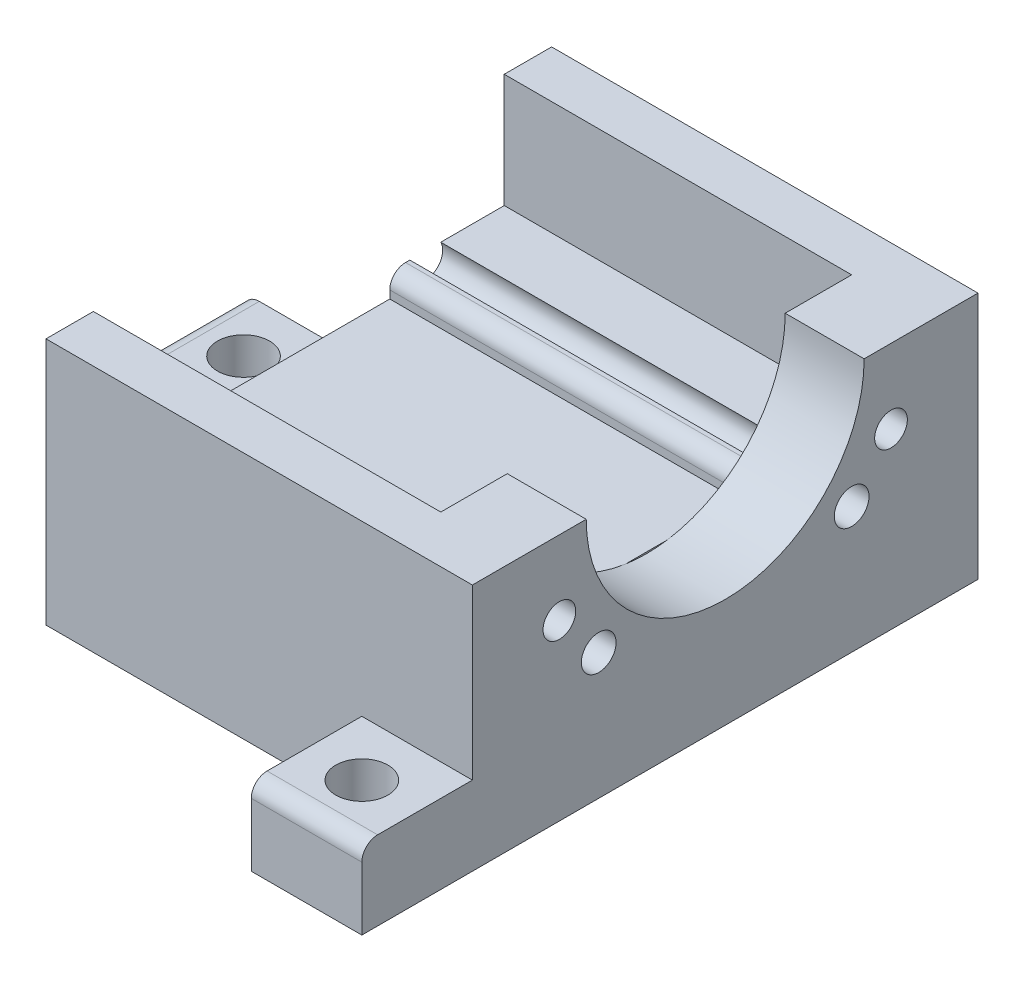
ISO-10303-21;
HEADER;
FILE_DESCRIPTION(('STEP AP214'),'2;1');
FILE_NAME('part.step','',(''),(''),'','','');
FILE_SCHEMA(('AUTOMOTIVE_DESIGN { 1 0 10303 214 1 1 1 1 }'));
ENDSEC;
DATA;
#1=APPLICATION_CONTEXT('core data for automotive mechanical design processes');
#2=APPLICATION_PROTOCOL_DEFINITION('international standard','automotive_design',2000,#1);
#3=PRODUCT_CONTEXT('',#1,'mechanical');
#4=PRODUCT('Part','Part','',(#3));
#5=PRODUCT_RELATED_PRODUCT_CATEGORY('part','',(#4));
#6=PRODUCT_DEFINITION_FORMATION('','',#4);
#7=PRODUCT_DEFINITION_CONTEXT('part definition',#1,'design');
#8=PRODUCT_DEFINITION('design','',#6,#7);
#9=PRODUCT_DEFINITION_SHAPE('','',#8);
#10=(LENGTH_UNIT() NAMED_UNIT(*) SI_UNIT(.MILLI.,.METRE.));
#11=(NAMED_UNIT(*) PLANE_ANGLE_UNIT() SI_UNIT($,.RADIAN.));
#12=(NAMED_UNIT(*) SI_UNIT($,.STERADIAN.) SOLID_ANGLE_UNIT());
#13=UNCERTAINTY_MEASURE_WITH_UNIT(LENGTH_MEASURE(1.E-05),#10,'distance_accuracy_value','');
#14=(GEOMETRIC_REPRESENTATION_CONTEXT(3) GLOBAL_UNCERTAINTY_ASSIGNED_CONTEXT((#13)) GLOBAL_UNIT_ASSIGNED_CONTEXT((#10,
#11,#12)) REPRESENTATION_CONTEXT('',''));
#15=CARTESIAN_POINT('',(0.,0.,0.));
#16=DIRECTION('',(0.,0.,1.));
#17=DIRECTION('',(1.,0.,0.));
#18=AXIS2_PLACEMENT_3D('',#15,#16,#17);
#19=CARTESIAN_POINT('',(-11.,0.,0.));
#20=DIRECTION('',(1.,0.,0.));
#21=DIRECTION('',(0.,0.,-1.));
#22=AXIS2_PLACEMENT_3D('',#19,#20,#21);
#23=PLANE('',#22);
#24=DIRECTION('',(0.,0.,1.));
#25=VECTOR('',#24,1.);
#26=CARTESIAN_POINT('',(-11.,8.5,5.7589));
#27=LINE('',#26,#25);
#28=CARTESIAN_POINT('',(-11.,8.5,6.7589));
#29=VERTEX_POINT('',#28);
#30=CARTESIAN_POINT('',(-11.,8.5,7.02910410288673));
#31=VERTEX_POINT('',#30);
#32=EDGE_CURVE('E428',#29,#31,#27,.T.);
#33=ORIENTED_EDGE('',*,*,#32,.F.);
#34=CARTESIAN_POINT('',(-11.,7.5,6.7589));
#35=DIRECTION('',(1.,0.,0.));
#36=DIRECTION('',(0.,0.,-1.));
#37=AXIS2_PLACEMENT_3D('',#34,#35,#36);
#38=CIRCLE('',#37,1.);
#39=CARTESIAN_POINT('',(-11.,7.5,5.7589));
#40=VERTEX_POINT('',#39);
#41=EDGE_CURVE('E451',#29,#40,#38,.F.);
#42=ORIENTED_EDGE('',*,*,#41,.T.);
#43=DIRECTION('',(0.,1.,0.));
#44=VECTOR('',#43,1.);
#45=CARTESIAN_POINT('',(-11.,7.,5.7589));
#46=LINE('',#45,#44);
#47=CARTESIAN_POINT('',(-11.,7.,5.7589));
#48=VERTEX_POINT('',#47);
#49=EDGE_CURVE('E424',#48,#40,#46,.T.);
#50=ORIENTED_EDGE('',*,*,#49,.F.);
#51=DIRECTION('',(0.,0.,1.));
#52=VECTOR('',#51,1.);
#53=CARTESIAN_POINT('',(-11.,7.,-5.7589));
#54=LINE('',#53,#52);
#55=CARTESIAN_POINT('',(-11.,7.,-5.7589));
#56=VERTEX_POINT('',#55);
#57=EDGE_CURVE('E422',#56,#48,#54,.T.);
#58=ORIENTED_EDGE('',*,*,#57,.F.);
#59=DIRECTION('',(0.,-1.,0.));
#60=VECTOR('',#59,1.);
#61=CARTESIAN_POINT('',(-11.,8.5,-5.7589));
#62=LINE('',#61,#60);
#63=CARTESIAN_POINT('',(-11.,7.5,-5.7589));
#64=VERTEX_POINT('',#63);
#65=EDGE_CURVE('E420',#64,#56,#62,.T.);
#66=ORIENTED_EDGE('',*,*,#65,.F.);
#67=CARTESIAN_POINT('',(-11.,7.5,-6.7589));
#68=DIRECTION('',(1.,0.,0.));
#69=DIRECTION('',(0.,0.,-1.));
#70=AXIS2_PLACEMENT_3D('',#67,#68,#69);
#71=CIRCLE('',#70,1.);
#72=CARTESIAN_POINT('',(-11.,8.5,-6.7589));
#73=VERTEX_POINT('',#72);
#74=EDGE_CURVE('E449',#64,#73,#71,.F.);
#75=ORIENTED_EDGE('',*,*,#74,.T.);
#76=DIRECTION('',(0.,0.,1.));
#77=VECTOR('',#76,1.);
#78=CARTESIAN_POINT('',(-11.,8.5,-13.0089));
#79=LINE('',#78,#77);
#80=CARTESIAN_POINT('',(-11.,8.5,-7.02910410288673));
#81=VERTEX_POINT('',#80);
#82=EDGE_CURVE('E416',#81,#73,#79,.T.);
#83=ORIENTED_EDGE('',*,*,#82,.F.);
#84=CARTESIAN_POINT('',(-11.,8.,-8.0089));
#85=DIRECTION('',(1.,0.,0.));
#86=DIRECTION('',(0.,0.,1.));
#87=AXIS2_PLACEMENT_3D('',#84,#85,#86);
#88=CIRCLE('',#87,1.1);
#89=CARTESIAN_POINT('',(-11.,8.5,-8.98869589711327));
#90=VERTEX_POINT('',#89);
#91=EDGE_CURVE('E296',#81,#90,#88,.T.);
#92=ORIENTED_EDGE('',*,*,#91,.T.);
#93=CARTESIAN_POINT('',(-11.,8.5,-13.0089));
#94=VERTEX_POINT('',#93);
#95=EDGE_CURVE('E417',#94,#90,#79,.T.);
#96=ORIENTED_EDGE('',*,*,#95,.F.);
#97=DIRECTION('',(0.,-1.,0.));
#98=VECTOR('',#97,1.);
#99=CARTESIAN_POINT('',(-11.,15.7,-13.0089));
#100=LINE('',#99,#98);
#101=CARTESIAN_POINT('',(-11.,15.7,-13.0089));
#102=VERTEX_POINT('',#101);
#103=EDGE_CURVE('E387',#102,#94,#100,.T.);
#104=ORIENTED_EDGE('',*,*,#103,.F.);
#105=DIRECTION('',(0.,0.,-1.));
#106=VECTOR('',#105,1.);
#107=CARTESIAN_POINT('',(-11.,15.7,-13.0089));
#108=LINE('',#107,#106);
#109=CARTESIAN_POINT('',(-11.,15.7,-16.0089));
#110=VERTEX_POINT('',#109);
#111=EDGE_CURVE('E377',#102,#110,#108,.T.);
#112=ORIENTED_EDGE('',*,*,#111,.T.);
#113=DIRECTION('',(0.,-1.,0.));
#114=VECTOR('',#113,1.);
#115=CARTESIAN_POINT('',(-11.,15.7,-16.0089));
#116=LINE('',#115,#114);
#117=CARTESIAN_POINT('',(-11.,0.,-16.0089));
#118=VERTEX_POINT('',#117);
#119=EDGE_CURVE('E385',#110,#118,#116,.T.);
#120=ORIENTED_EDGE('',*,*,#119,.T.);
#121=DIRECTION('',(0.,0.,-1.));
#122=VECTOR('',#121,1.);
#123=CARTESIAN_POINT('',(-11.,0.,13.0089));
#124=LINE('',#123,#122);
#125=CARTESIAN_POINT('',(-11.,0.,-3.5));
#126=VERTEX_POINT('',#125);
#127=EDGE_CURVE('E389',#126,#118,#124,.T.);
#128=ORIENTED_EDGE('',*,*,#127,.F.);
#129=DIRECTION('',(0.,-1.,0.));
#130=VECTOR('',#129,1.);
#131=CARTESIAN_POINT('',(-11.,5.,-3.5));
#132=LINE('',#131,#130);
#133=CARTESIAN_POINT('',(-11.,5.,-3.5));
#134=VERTEX_POINT('',#133);
#135=EDGE_CURVE('E282',#134,#126,#132,.T.);
#136=ORIENTED_EDGE('',*,*,#135,.F.);
#137=DIRECTION('',(0.,0.,1.));
#138=VECTOR('',#137,1.);
#139=CARTESIAN_POINT('',(-11.,5.,3.5));
#140=LINE('',#139,#138);
#141=CARTESIAN_POINT('',(-11.,5.,3.5));
#142=VERTEX_POINT('',#141);
#143=EDGE_CURVE('E269',#134,#142,#140,.T.);
#144=ORIENTED_EDGE('',*,*,#143,.T.);
#145=DIRECTION('',(0.,-1.,0.));
#146=VECTOR('',#145,1.);
#147=CARTESIAN_POINT('',(-11.,5.,3.5));
#148=LINE('',#147,#146);
#149=CARTESIAN_POINT('',(-11.,0.,3.5));
#150=VERTEX_POINT('',#149);
#151=EDGE_CURVE('E276',#142,#150,#148,.T.);
#152=ORIENTED_EDGE('',*,*,#151,.T.);
#153=CARTESIAN_POINT('',(-11.,0.,16.0089));
#154=VERTEX_POINT('',#153);
#155=EDGE_CURVE('E413',#154,#150,#124,.T.);
#156=ORIENTED_EDGE('',*,*,#155,.F.);
#157=DIRECTION('',(0.,-1.,0.));
#158=VECTOR('',#157,1.);
#159=CARTESIAN_POINT('',(-11.,15.7,16.0089));
#160=LINE('',#159,#158);
#161=CARTESIAN_POINT('',(-11.,15.7,16.0089));
#162=VERTEX_POINT('',#161);
#163=EDGE_CURVE('E369',#162,#154,#160,.T.);
#164=ORIENTED_EDGE('',*,*,#163,.F.);
#165=DIRECTION('',(0.,0.,-1.));
#166=VECTOR('',#165,1.);
#167=CARTESIAN_POINT('',(-11.,15.7,13.0089));
#168=LINE('',#167,#166);
#169=CARTESIAN_POINT('',(-11.,15.7,13.0089));
#170=VERTEX_POINT('',#169);
#171=EDGE_CURVE('E359',#162,#170,#168,.T.);
#172=ORIENTED_EDGE('',*,*,#171,.T.);
#173=DIRECTION('',(0.,-1.,0.));
#174=VECTOR('',#173,1.);
#175=CARTESIAN_POINT('',(-11.,15.7,13.0089));
#176=LINE('',#175,#174);
#177=CARTESIAN_POINT('',(-11.,8.5,13.0089));
#178=VERTEX_POINT('',#177);
#179=EDGE_CURVE('E367',#170,#178,#176,.T.);
#180=ORIENTED_EDGE('',*,*,#179,.T.);
#181=CARTESIAN_POINT('',(-11.,8.5,8.98869589711327));
#182=VERTEX_POINT('',#181);
#183=EDGE_CURVE('E427',#182,#178,#27,.T.);
#184=ORIENTED_EDGE('',*,*,#183,.F.);
#185=CARTESIAN_POINT('',(-11.,8.,8.0089));
#186=DIRECTION('',(1.,0.,0.));
#187=DIRECTION('',(0.,0.,-1.));
#188=AXIS2_PLACEMENT_3D('',#185,#186,#187);
#189=CIRCLE('',#188,1.1);
#190=EDGE_CURVE('E304',#182,#31,#189,.T.);
#191=ORIENTED_EDGE('',*,*,#190,.T.);
#192=EDGE_LOOP('',(#33,#42,#50,#58,#66,#75,#83,#92,#96,#104,#112,#120,#128,#136,#144,#152,#156,
#164,#172,#180,#184,#191));
#193=FACE_BOUND('',#192,.T.);
#194=ADVANCED_FACE('F35',(#193),#23,.F.);
#195=CARTESIAN_POINT('',(11.,8.5,-13.0089));
#196=DIRECTION('',(0.,-1.,0.));
#197=DIRECTION('',(0.,0.,-1.));
#198=AXIS2_PLACEMENT_3D('',#195,#196,#197);
#199=PLANE('',#198);
#200=ORIENTED_EDGE('',*,*,#95,.T.);
#201=DIRECTION('',(1.,0.,0.));
#202=VECTOR('',#201,1.);
#203=CARTESIAN_POINT('',(-11.,8.5,-8.98869589711327));
#204=LINE('',#203,#202);
#205=CARTESIAN_POINT('',(11.,8.5,-8.98869589711327));
#206=VERTEX_POINT('',#205);
#207=EDGE_CURVE('E324',#90,#206,#204,.T.);
#208=ORIENTED_EDGE('',*,*,#207,.T.);
#209=DIRECTION('',(0.,0.,1.));
#210=VECTOR('',#209,1.);
#211=CARTESIAN_POINT('',(11.,8.5,-13.0089));
#212=LINE('',#211,#210);
#213=CARTESIAN_POINT('',(11.,8.5,-13.0089));
#214=VERTEX_POINT('',#213);
#215=EDGE_CURVE('E395',#214,#206,#212,.T.);
#216=ORIENTED_EDGE('',*,*,#215,.F.);
#217=DIRECTION('',(-1.,0.,0.));
#218=VECTOR('',#217,1.);
#219=CARTESIAN_POINT('',(11.,8.5,-13.0089));
#220=LINE('',#219,#218);
#221=EDGE_CURVE('E438',#214,#94,#220,.T.);
#222=ORIENTED_EDGE('',*,*,#221,.T.);
#223=EDGE_LOOP('',(#200,#208,#216,#222));
#224=FACE_BOUND('',#223,.T.);
#225=ADVANCED_FACE('F522',(#224),#199,.F.);
#226=CARTESIAN_POINT('',(11.,8.5,5.7589));
#227=DIRECTION('',(0.,-1.,0.));
#228=DIRECTION('',(0.,0.,-1.));
#229=AXIS2_PLACEMENT_3D('',#226,#227,#228);
#230=PLANE('',#229);
#231=DIRECTION('',(0.,0.,1.));
#232=VECTOR('',#231,1.);
#233=CARTESIAN_POINT('',(11.,8.5,5.7589));
#234=LINE('',#233,#232);
#235=CARTESIAN_POINT('',(11.,8.5,6.7589));
#236=VERTEX_POINT('',#235);
#237=CARTESIAN_POINT('',(11.,8.5,7.02910410288673));
#238=VERTEX_POINT('',#237);
#239=EDGE_CURVE('E410',#236,#238,#234,.T.);
#240=ORIENTED_EDGE('',*,*,#239,.F.);
#241=DIRECTION('',(-1.,0.,0.));
#242=VECTOR('',#241,1.);
#243=CARTESIAN_POINT('',(11.,8.5,6.7589));
#244=LINE('',#243,#242);
#245=EDGE_CURVE('E444',#236,#29,#244,.T.);
#246=ORIENTED_EDGE('',*,*,#245,.T.);
#247=ORIENTED_EDGE('',*,*,#32,.T.);
#248=DIRECTION('',(1.,0.,0.));
#249=VECTOR('',#248,1.);
#250=CARTESIAN_POINT('',(-11.,8.5,7.02910410288673));
#251=LINE('',#250,#249);
#252=EDGE_CURVE('E311',#31,#238,#251,.T.);
#253=ORIENTED_EDGE('',*,*,#252,.T.);
#254=EDGE_LOOP('',(#240,#246,#247,#253));
#255=FACE_BOUND('',#254,.T.);
#256=ADVANCED_FACE('F485',(#255),#230,.F.);
#257=CARTESIAN_POINT('',(11.,0.,0.));
#258=DIRECTION('',(1.,0.,0.));
#259=DIRECTION('',(0.,0.,-1.));
#260=AXIS2_PLACEMENT_3D('',#257,#258,#259);
#261=PLANE('',#260);
#262=CARTESIAN_POINT('',(11.,15.7,0.));
#263=DIRECTION('',(-1.,0.,0.));
#264=DIRECTION('',(0.,0.,-1.));
#265=AXIS2_PLACEMENT_3D('',#262,#263,#264);
#266=CIRCLE('',#265,8.8);
#267=CARTESIAN_POINT('',(11.,7.,-1.32287565553229));
#268=VERTEX_POINT('',#267);
#269=CARTESIAN_POINT('',(11.,7.,1.32287565553229));
#270=VERTEX_POINT('',#269);
#271=EDGE_CURVE('E350',#268,#270,#266,.T.);
#272=ORIENTED_EDGE('',*,*,#271,.F.);
#273=DIRECTION('',(0.,0.,1.));
#274=VECTOR('',#273,1.);
#275=CARTESIAN_POINT('',(11.,7.,-5.7589));
#276=LINE('',#275,#274);
#277=EDGE_CURVE('E406',#268,#270,#276,.T.);
#278=ORIENTED_EDGE('',*,*,#277,.T.);
#279=EDGE_LOOP('',(#272,#278));
#280=FACE_BOUND('',#279,.T.);
#281=ADVANCED_FACE('F599',(#280),#261,.T.);
#282=CARTESIAN_POINT('',(11.,0.,13.0089));
#283=DIRECTION('',(0.,1.,0.));
#284=DIRECTION('',(0.,0.,1.));
#285=AXIS2_PLACEMENT_3D('',#282,#283,#284);
#286=PLANE('',#285);
#287=CARTESIAN_POINT('',(-14.5,0.,0.));
#288=DIRECTION('',(0.,1.,0.));
#289=DIRECTION('',(0.,0.,1.));
#290=AXIS2_PLACEMENT_3D('',#287,#288,#289);
#291=CIRCLE('',#290,1.65);
#292=CARTESIAN_POINT('',(-14.5,0.,1.65));
#293=VERTEX_POINT('',#292);
#294=EDGE_CURVE('E562',#293,#293,#291,.T.);
#295=ORIENTED_EDGE('',*,*,#294,.T.);
#296=EDGE_LOOP('',(#295));
#297=FACE_BOUND('',#296,.T.);
#298=CARTESIAN_POINT('',(12.5,0.,19.5089));
#299=DIRECTION('',(0.,1.,0.));
#300=DIRECTION('',(0.,0.,1.));
#301=AXIS2_PLACEMENT_3D('',#298,#299,#300);
#302=CIRCLE('',#301,1.65);
#303=CARTESIAN_POINT('',(12.5,0.,21.1589));
#304=VERTEX_POINT('',#303);
#305=EDGE_CURVE('E570',#304,#304,#302,.T.);
#306=ORIENTED_EDGE('',*,*,#305,.T.);
#307=EDGE_LOOP('',(#306));
#308=FACE_BOUND('',#307,.T.);
#309=ORIENTED_EDGE('',*,*,#155,.T.);
#310=DIRECTION('',(-1.,0.,0.));
#311=VECTOR('',#310,1.);
#312=CARTESIAN_POINT('',(-11.,0.,3.5));
#313=LINE('',#312,#311);
#314=CARTESIAN_POINT('',(-18.,0.,3.5));
#315=VERTEX_POINT('',#314);
#316=EDGE_CURVE('E257',#150,#315,#313,.T.);
#317=ORIENTED_EDGE('',*,*,#316,.T.);
#318=DIRECTION('',(0.,0.,-1.));
#319=VECTOR('',#318,1.);
#320=CARTESIAN_POINT('',(-18.,0.,3.5));
#321=LINE('',#320,#319);
#322=CARTESIAN_POINT('',(-18.,0.,-3.5));
#323=VERTEX_POINT('',#322);
#324=EDGE_CURVE('E261',#315,#323,#321,.T.);
#325=ORIENTED_EDGE('',*,*,#324,.T.);
#326=DIRECTION('',(1.,0.,0.));
#327=VECTOR('',#326,1.);
#328=CARTESIAN_POINT('',(-11.,0.,-3.5));
#329=LINE('',#328,#327);
#330=EDGE_CURVE('E273',#323,#126,#329,.T.);
#331=ORIENTED_EDGE('',*,*,#330,.T.);
#332=ORIENTED_EDGE('',*,*,#127,.T.);
#333=DIRECTION('',(1.,0.,0.));
#334=VECTOR('',#333,1.);
#335=CARTESIAN_POINT('',(-11.,0.,-16.0089));
#336=LINE('',#335,#334);
#337=CARTESIAN_POINT('',(16.,0.,-16.0089));
#338=VERTEX_POINT('',#337);
#339=EDGE_CURVE('E371',#118,#338,#336,.T.);
#340=ORIENTED_EDGE('',*,*,#339,.T.);
#341=DIRECTION('',(0.,0.,-1.));
#342=VECTOR('',#341,1.);
#343=CARTESIAN_POINT('',(16.,0.,16.0089));
#344=LINE('',#343,#342);
#345=CARTESIAN_POINT('',(16.,0.,23.0089));
#346=VERTEX_POINT('',#345);
#347=EDGE_CURVE('E337',#346,#338,#344,.T.);
#348=ORIENTED_EDGE('',*,*,#347,.F.);
#349=DIRECTION('',(-1.,0.,0.));
#350=VECTOR('',#349,1.);
#351=CARTESIAN_POINT('',(16.,0.,23.0089));
#352=LINE('',#351,#350);
#353=CARTESIAN_POINT('',(9.,0.,23.0089));
#354=VERTEX_POINT('',#353);
#355=EDGE_CURVE('E560',#346,#354,#352,.T.);
#356=ORIENTED_EDGE('',*,*,#355,.T.);
#357=DIRECTION('',(0.,0.,-1.));
#358=VECTOR('',#357,1.);
#359=CARTESIAN_POINT('',(9.,0.,16.0089));
#360=LINE('',#359,#358);
#361=CARTESIAN_POINT('',(9.,0.,16.0089));
#362=VERTEX_POINT('',#361);
#363=EDGE_CURVE('E265',#354,#362,#360,.T.);
#364=ORIENTED_EDGE('',*,*,#363,.T.);
#365=DIRECTION('',(-1.,0.,0.));
#366=VECTOR('',#365,1.);
#367=CARTESIAN_POINT('',(-11.,0.,16.0089));
#368=LINE('',#367,#366);
#369=EDGE_CURVE('E256',#362,#154,#368,.T.);
#370=ORIENTED_EDGE('',*,*,#369,.T.);
#371=EDGE_LOOP('',(#309,#317,#325,#331,#332,#340,#348,#356,#364,#370));
#372=FACE_BOUND('',#371,.T.);
#373=ADVANCED_FACE('F550',(#297,#308,#372),#286,.F.);
#374=ORIENTED_EDGE('',*,*,#82,.T.);
#375=DIRECTION('',(-1.,0.,0.));
#376=VECTOR('',#375,1.);
#377=CARTESIAN_POINT('',(11.,8.5,-6.7589));
#378=LINE('',#377,#376);
#379=CARTESIAN_POINT('',(11.,8.5,-6.7589));
#380=VERTEX_POINT('',#379);
#381=EDGE_CURVE('E458',#73,#380,#378,.F.);
#382=ORIENTED_EDGE('',*,*,#381,.T.);
#383=CARTESIAN_POINT('',(11.,8.5,-7.02910410288673));
#384=VERTEX_POINT('',#383);
#385=EDGE_CURVE('E399',#384,#380,#212,.T.);
#386=ORIENTED_EDGE('',*,*,#385,.F.);
#387=DIRECTION('',(1.,0.,0.));
#388=VECTOR('',#387,1.);
#389=CARTESIAN_POINT('',(-11.,8.5,-7.02910410288673));
#390=LINE('',#389,#388);
#391=EDGE_CURVE('E321',#384,#81,#390,.F.);
#392=ORIENTED_EDGE('',*,*,#391,.T.);
#393=EDGE_LOOP('',(#374,#382,#386,#392));
#394=FACE_BOUND('',#393,.T.);
#395=ADVANCED_FACE('F515',(#394),#199,.F.);
#396=CARTESIAN_POINT('',(11.,8.5,-5.7589));
#397=DIRECTION('',(0.,0.,-1.));
#398=DIRECTION('',(0.,1.,0.));
#399=AXIS2_PLACEMENT_3D('',#396,#397,#398);
#400=PLANE('',#399);
#401=DIRECTION('',(0.,-1.,0.));
#402=VECTOR('',#401,1.);
#403=CARTESIAN_POINT('',(11.,8.5,-5.7589));
#404=LINE('',#403,#402);
#405=CARTESIAN_POINT('',(11.,7.5,-5.7589));
#406=VERTEX_POINT('',#405);
#407=CARTESIAN_POINT('',(11.,7.,-5.7589));
#408=VERTEX_POINT('',#407);
#409=EDGE_CURVE('E398',#406,#408,#404,.T.);
#410=ORIENTED_EDGE('',*,*,#409,.F.);
#411=DIRECTION('',(-1.,0.,0.));
#412=VECTOR('',#411,1.);
#413=CARTESIAN_POINT('',(11.,7.5,-5.7589));
#414=LINE('',#413,#412);
#415=EDGE_CURVE('E455',#406,#64,#414,.T.);
#416=ORIENTED_EDGE('',*,*,#415,.T.);
#417=ORIENTED_EDGE('',*,*,#65,.T.);
#418=DIRECTION('',(-1.,0.,0.));
#419=VECTOR('',#418,1.);
#420=CARTESIAN_POINT('',(11.,7.,-5.7589));
#421=LINE('',#420,#419);
#422=EDGE_CURVE('E435',#408,#56,#421,.T.);
#423=ORIENTED_EDGE('',*,*,#422,.F.);
#424=EDGE_LOOP('',(#410,#416,#417,#423));
#425=FACE_BOUND('',#424,.T.);
#426=ADVANCED_FACE('F506',(#425),#400,.F.);
#427=CARTESIAN_POINT('',(11.,7.,-5.7589));
#428=DIRECTION('',(0.,-1.,0.));
#429=DIRECTION('',(0.,0.,-1.));
#430=AXIS2_PLACEMENT_3D('',#427,#428,#429);
#431=PLANE('',#430);
#432=ORIENTED_EDGE('',*,*,#57,.T.);
#433=DIRECTION('',(-1.,0.,0.));
#434=VECTOR('',#433,1.);
#435=CARTESIAN_POINT('',(11.,7.,5.7589));
#436=LINE('',#435,#434);
#437=CARTESIAN_POINT('',(11.,7.,5.7589));
#438=VERTEX_POINT('',#437);
#439=EDGE_CURVE('E432',#438,#48,#436,.T.);
#440=ORIENTED_EDGE('',*,*,#439,.F.);
#441=EDGE_CURVE('E401',#270,#438,#276,.T.);
#442=ORIENTED_EDGE('',*,*,#441,.F.);
#443=ORIENTED_EDGE('',*,*,#277,.F.);
#444=EDGE_CURVE('E402',#408,#268,#276,.T.);
#445=ORIENTED_EDGE('',*,*,#444,.F.);
#446=ORIENTED_EDGE('',*,*,#422,.T.);
#447=EDGE_LOOP('',(#432,#440,#442,#443,#445,#446));
#448=FACE_BOUND('',#447,.T.);
#449=ADVANCED_FACE('F496',(#448),#431,.F.);
#450=CARTESIAN_POINT('',(11.,7.,5.7589));
#451=DIRECTION('',(0.,0.,1.));
#452=DIRECTION('',(0.,-1.,0.));
#453=AXIS2_PLACEMENT_3D('',#450,#451,#452);
#454=PLANE('',#453);
#455=ORIENTED_EDGE('',*,*,#49,.T.);
#456=DIRECTION('',(-1.,0.,0.));
#457=VECTOR('',#456,1.);
#458=CARTESIAN_POINT('',(11.,7.5,5.7589));
#459=LINE('',#458,#457);
#460=CARTESIAN_POINT('',(11.,7.5,5.7589));
#461=VERTEX_POINT('',#460);
#462=EDGE_CURVE('E453',#40,#461,#459,.F.);
#463=ORIENTED_EDGE('',*,*,#462,.T.);
#464=DIRECTION('',(0.,1.,0.));
#465=VECTOR('',#464,1.);
#466=CARTESIAN_POINT('',(11.,7.,5.7589));
#467=LINE('',#466,#465);
#468=EDGE_CURVE('E405',#438,#461,#467,.T.);
#469=ORIENTED_EDGE('',*,*,#468,.F.);
#470=ORIENTED_EDGE('',*,*,#439,.T.);
#471=EDGE_LOOP('',(#455,#463,#469,#470));
#472=FACE_BOUND('',#471,.T.);
#473=ADVANCED_FACE('F493',(#472),#454,.F.);
#474=CARTESIAN_POINT('',(11.,8.5,8.98869589711327));
#475=VERTEX_POINT('',#474);
#476=CARTESIAN_POINT('',(11.,8.5,13.0089));
#477=VERTEX_POINT('',#476);
#478=EDGE_CURVE('E409',#475,#477,#234,.T.);
#479=ORIENTED_EDGE('',*,*,#478,.F.);
#480=DIRECTION('',(1.,0.,0.));
#481=VECTOR('',#480,1.);
#482=CARTESIAN_POINT('',(-11.,8.5,8.98869589711327));
#483=LINE('',#482,#481);
#484=EDGE_CURVE('E294',#475,#182,#483,.F.);
#485=ORIENTED_EDGE('',*,*,#484,.T.);
#486=ORIENTED_EDGE('',*,*,#183,.T.);
#487=DIRECTION('',(-1.,0.,0.));
#488=VECTOR('',#487,1.);
#489=CARTESIAN_POINT('',(11.,8.5,13.0089));
#490=LINE('',#489,#488);
#491=EDGE_CURVE('E412',#477,#178,#490,.T.);
#492=ORIENTED_EDGE('',*,*,#491,.F.);
#493=EDGE_LOOP('',(#479,#485,#486,#492));
#494=FACE_BOUND('',#493,.T.);
#495=ADVANCED_FACE('F601',(#494),#230,.F.);
#496=CARTESIAN_POINT('',(-11.,15.7,-13.0089));
#497=DIRECTION('',(0.,0.,1.));
#498=DIRECTION('',(1.,0.,0.));
#499=AXIS2_PLACEMENT_3D('',#496,#497,#498);
#500=PLANE('',#499);
#501=ORIENTED_EDGE('',*,*,#221,.F.);
#502=DIRECTION('',(0.,-1.,0.));
#503=VECTOR('',#502,1.);
#504=CARTESIAN_POINT('',(11.,15.7,-13.0089));
#505=LINE('',#504,#503);
#506=CARTESIAN_POINT('',(11.,15.7,-13.0089));
#507=VERTEX_POINT('',#506);
#508=EDGE_CURVE('E390',#507,#214,#505,.T.);
#509=ORIENTED_EDGE('',*,*,#508,.F.);
#510=DIRECTION('',(-1.,0.,0.));
#511=VECTOR('',#510,1.);
#512=CARTESIAN_POINT('',(-11.,15.7,-13.0089));
#513=LINE('',#512,#511);
#514=EDGE_CURVE('E382',#507,#102,#513,.T.);
#515=ORIENTED_EDGE('',*,*,#514,.T.);
#516=ORIENTED_EDGE('',*,*,#103,.T.);
#517=EDGE_LOOP('',(#501,#509,#515,#516));
#518=FACE_BOUND('',#517,.T.);
#519=ADVANCED_FACE('F532',(#518),#500,.T.);
#520=CARTESIAN_POINT('',(-11.,15.7,-16.0089));
#521=DIRECTION('',(0.,0.,-1.));
#522=DIRECTION('',(-1.,0.,0.));
#523=AXIS2_PLACEMENT_3D('',#520,#521,#522);
#524=PLANE('',#523);
#525=ORIENTED_EDGE('',*,*,#339,.F.);
#526=ORIENTED_EDGE('',*,*,#119,.F.);
#527=DIRECTION('',(1.,0.,0.));
#528=VECTOR('',#527,1.);
#529=CARTESIAN_POINT('',(-11.,15.7,-16.0089));
#530=LINE('',#529,#528);
#531=CARTESIAN_POINT('',(16.,15.7,-16.0089));
#532=VERTEX_POINT('',#531);
#533=EDGE_CURVE('E380',#110,#532,#530,.T.);
#534=ORIENTED_EDGE('',*,*,#533,.T.);
#535=DIRECTION('',(0.,1.,0.));
#536=VECTOR('',#535,1.);
#537=CARTESIAN_POINT('',(16.,0.,-16.0089));
#538=LINE('',#537,#536);
#539=EDGE_CURVE('E340',#338,#532,#538,.T.);
#540=ORIENTED_EDGE('',*,*,#539,.F.);
#541=EDGE_LOOP('',(#525,#526,#534,#540));
#542=FACE_BOUND('',#541,.T.);
#543=ADVANCED_FACE('F546',(#542),#524,.T.);
#544=CARTESIAN_POINT('',(0.,15.7,0.));
#545=DIRECTION('',(0.,-1.,0.));
#546=DIRECTION('',(0.,0.,-1.));
#547=AXIS2_PLACEMENT_3D('',#544,#545,#546);
#548=PLANE('',#547);
#549=ORIENTED_EDGE('',*,*,#111,.F.);
#550=ORIENTED_EDGE('',*,*,#514,.F.);
#551=DIRECTION('',(0.,0.,1.));
#552=VECTOR('',#551,1.);
#553=CARTESIAN_POINT('',(11.,15.7,-16.0089));
#554=LINE('',#553,#552);
#555=CARTESIAN_POINT('',(11.,15.7,-8.8));
#556=VERTEX_POINT('',#555);
#557=EDGE_CURVE('E332',#507,#556,#554,.T.);
#558=ORIENTED_EDGE('',*,*,#557,.T.);
#559=DIRECTION('',(-1.,0.,0.));
#560=VECTOR('',#559,1.);
#561=CARTESIAN_POINT('',(16.,15.7,-8.8));
#562=LINE('',#561,#560);
#563=CARTESIAN_POINT('',(16.,15.7,-8.8));
#564=VERTEX_POINT('',#563);
#565=EDGE_CURVE('E345',#564,#556,#562,.T.);
#566=ORIENTED_EDGE('',*,*,#565,.F.);
#567=DIRECTION('',(0.,0.,1.));
#568=VECTOR('',#567,1.);
#569=CARTESIAN_POINT('',(16.,15.7,-16.0089));
#570=LINE('',#569,#568);
#571=EDGE_CURVE('E343',#532,#564,#570,.T.);
#572=ORIENTED_EDGE('',*,*,#571,.F.);
#573=ORIENTED_EDGE('',*,*,#533,.F.);
#574=EDGE_LOOP('',(#549,#550,#558,#566,#572,#573));
#575=FACE_BOUND('',#574,.T.);
#576=ADVANCED_FACE('F529',(#575),#548,.F.);
#577=CARTESIAN_POINT('',(-11.,15.7,16.0089));
#578=DIRECTION('',(0.,0.,1.));
#579=DIRECTION('',(1.,0.,0.));
#580=AXIS2_PLACEMENT_3D('',#577,#578,#579);
#581=PLANE('',#580);
#582=DIRECTION('',(0.,-1.,0.));
#583=VECTOR('',#582,1.);
#584=CARTESIAN_POINT('',(9.,5.,16.0089));
#585=LINE('',#584,#583);
#586=CARTESIAN_POINT('',(9.,5.,16.0089));
#587=VERTEX_POINT('',#586);
#588=EDGE_CURVE('E237',#587,#362,#585,.T.);
#589=ORIENTED_EDGE('',*,*,#588,.F.);
#590=DIRECTION('',(1.,0.,0.));
#591=VECTOR('',#590,1.);
#592=CARTESIAN_POINT('',(16.,5.,16.0089));
#593=LINE('',#592,#591);
#594=CARTESIAN_POINT('',(16.,5.,16.0089));
#595=VERTEX_POINT('',#594);
#596=EDGE_CURVE('E242',#587,#595,#593,.T.);
#597=ORIENTED_EDGE('',*,*,#596,.T.);
#598=DIRECTION('',(0.,-1.,0.));
#599=VECTOR('',#598,1.);
#600=CARTESIAN_POINT('',(16.,15.7,16.0089));
#601=LINE('',#600,#599);
#602=CARTESIAN_POINT('',(16.,15.7,16.0089));
#603=VERTEX_POINT('',#602);
#604=EDGE_CURVE('E335',#603,#595,#601,.T.);
#605=ORIENTED_EDGE('',*,*,#604,.F.);
#606=DIRECTION('',(-1.,0.,0.));
#607=VECTOR('',#606,1.);
#608=CARTESIAN_POINT('',(-11.,15.7,16.0089));
#609=LINE('',#608,#607);
#610=EDGE_CURVE('E364',#603,#162,#609,.T.);
#611=ORIENTED_EDGE('',*,*,#610,.T.);
#612=ORIENTED_EDGE('',*,*,#163,.T.);
#613=ORIENTED_EDGE('',*,*,#369,.F.);
#614=EDGE_LOOP('',(#589,#597,#605,#611,#612,#613));
#615=FACE_BOUND('',#614,.T.);
#616=ADVANCED_FACE('F254',(#615),#581,.T.);
#617=CARTESIAN_POINT('',(-11.,15.7,13.0089));
#618=DIRECTION('',(0.,0.,-1.));
#619=DIRECTION('',(-1.,0.,0.));
#620=AXIS2_PLACEMENT_3D('',#617,#618,#619);
#621=PLANE('',#620);
#622=DIRECTION('',(0.,-1.,0.));
#623=VECTOR('',#622,1.);
#624=CARTESIAN_POINT('',(11.,15.7,13.0089));
#625=LINE('',#624,#623);
#626=CARTESIAN_POINT('',(11.,15.7,13.0089));
#627=VERTEX_POINT('',#626);
#628=EDGE_CURVE('E372',#627,#477,#625,.T.);
#629=ORIENTED_EDGE('',*,*,#628,.T.);
#630=ORIENTED_EDGE('',*,*,#491,.T.);
#631=ORIENTED_EDGE('',*,*,#179,.F.);
#632=DIRECTION('',(1.,0.,0.));
#633=VECTOR('',#632,1.);
#634=CARTESIAN_POINT('',(-11.,15.7,13.0089));
#635=LINE('',#634,#633);
#636=EDGE_CURVE('E362',#170,#627,#635,.T.);
#637=ORIENTED_EDGE('',*,*,#636,.T.);
#638=EDGE_LOOP('',(#629,#630,#631,#637));
#639=FACE_BOUND('',#638,.T.);
#640=ADVANCED_FACE('F750',(#639),#621,.T.);
#641=CARTESIAN_POINT('',(0.,15.7,0.));
#642=DIRECTION('',(0.,1.,0.));
#643=DIRECTION('',(0.,0.,1.));
#644=AXIS2_PLACEMENT_3D('',#641,#642,#643);
#645=PLANE('',#644);
#646=ORIENTED_EDGE('',*,*,#171,.F.);
#647=ORIENTED_EDGE('',*,*,#610,.F.);
#648=DIRECTION('',(0.,0.,1.));
#649=VECTOR('',#648,1.);
#650=CARTESIAN_POINT('',(16.,15.7,8.8));
#651=LINE('',#650,#649);
#652=CARTESIAN_POINT('',(16.,15.7,8.8));
#653=VERTEX_POINT('',#652);
#654=EDGE_CURVE('E331',#653,#603,#651,.T.);
#655=ORIENTED_EDGE('',*,*,#654,.F.);
#656=DIRECTION('',(-1.,0.,0.));
#657=VECTOR('',#656,1.);
#658=CARTESIAN_POINT('',(16.,15.7,8.8));
#659=LINE('',#658,#657);
#660=CARTESIAN_POINT('',(11.,15.7,8.8));
#661=VERTEX_POINT('',#660);
#662=EDGE_CURVE('E356',#653,#661,#659,.T.);
#663=ORIENTED_EDGE('',*,*,#662,.T.);
#664=DIRECTION('',(0.,0.,1.));
#665=VECTOR('',#664,1.);
#666=CARTESIAN_POINT('',(11.,15.7,8.8));
#667=LINE('',#666,#665);
#668=EDGE_CURVE('E349',#661,#627,#667,.T.);
#669=ORIENTED_EDGE('',*,*,#668,.T.);
#670=ORIENTED_EDGE('',*,*,#636,.F.);
#671=EDGE_LOOP('',(#646,#647,#655,#663,#669,#670));
#672=FACE_BOUND('',#671,.T.);
#673=ADVANCED_FACE('F827',(#672),#645,.T.);
#674=CARTESIAN_POINT('',(11.,15.7,0.));
#675=DIRECTION('',(1.,0.,0.));
#676=DIRECTION('',(0.,0.,-1.));
#677=AXIS2_PLACEMENT_3D('',#674,#675,#676);
#678=PLANE('',#677);
#679=CARTESIAN_POINT('',(11.,11.,-10.5));
#680=DIRECTION('',(1.,0.,0.));
#681=DIRECTION('',(0.,0.,-1.));
#682=AXIS2_PLACEMENT_3D('',#679,#680,#681);
#683=CIRCLE('',#682,1.035);
#684=CARTESIAN_POINT('',(11.,11.,-11.535));
#685=VERTEX_POINT('',#684);
#686=EDGE_CURVE('E315',#685,#685,#683,.T.);
#687=ORIENTED_EDGE('',*,*,#686,.T.);
#688=EDGE_LOOP('',(#687));
#689=FACE_BOUND('',#688,.T.);
#690=ORIENTED_EDGE('',*,*,#215,.T.);
#691=CARTESIAN_POINT('',(11.,8.,-8.0089));
#692=DIRECTION('',(1.,0.,0.));
#693=DIRECTION('',(0.,0.,-1.));
#694=AXIS2_PLACEMENT_3D('',#691,#692,#693);
#695=CIRCLE('',#694,1.1);
#696=EDGE_CURVE('E318',#206,#384,#695,.T.);
#697=ORIENTED_EDGE('',*,*,#696,.T.);
#698=ORIENTED_EDGE('',*,*,#385,.T.);
#699=CARTESIAN_POINT('',(11.,7.5,-6.7589));
#700=DIRECTION('',(1.,0.,0.));
#701=DIRECTION('',(0.,0.,-1.));
#702=AXIS2_PLACEMENT_3D('',#699,#700,#701);
#703=CIRCLE('',#702,1.);
#704=EDGE_CURVE('E11',#380,#406,#703,.T.);
#705=ORIENTED_EDGE('',*,*,#704,.T.);
#706=ORIENTED_EDGE('',*,*,#409,.T.);
#707=ORIENTED_EDGE('',*,*,#444,.T.);
#708=EDGE_CURVE('E346',#556,#268,#266,.T.);
#709=ORIENTED_EDGE('',*,*,#708,.F.);
#710=ORIENTED_EDGE('',*,*,#557,.F.);
#711=ORIENTED_EDGE('',*,*,#508,.T.);
#712=EDGE_LOOP('',(#690,#697,#698,#705,#706,#707,#709,#710,#711));
#713=FACE_BOUND('',#712,.T.);
#714=ADVANCED_FACE('F517',(#689,#713),#678,.F.);
#715=CARTESIAN_POINT('',(16.,15.7,0.));
#716=DIRECTION('',(-1.,0.,0.));
#717=DIRECTION('',(0.,0.,1.));
#718=AXIS2_PLACEMENT_3D('',#715,#716,#717);
#719=CYLINDRICAL_SURFACE('',#718,8.8);
#720=ORIENTED_EDGE('',*,*,#708,.T.);
#721=ORIENTED_EDGE('',*,*,#271,.T.);
#722=EDGE_CURVE('E327',#270,#661,#266,.T.);
#723=ORIENTED_EDGE('',*,*,#722,.T.);
#724=ORIENTED_EDGE('',*,*,#662,.F.);
#725=CARTESIAN_POINT('',(16.,15.7,0.));
#726=DIRECTION('',(-1.,0.,0.));
#727=DIRECTION('',(0.,0.,-1.));
#728=AXIS2_PLACEMENT_3D('',#725,#726,#727);
#729=CIRCLE('',#728,8.8);
#730=EDGE_CURVE('E328',#564,#653,#729,.T.);
#731=ORIENTED_EDGE('',*,*,#730,.F.);
#732=ORIENTED_EDGE('',*,*,#565,.T.);
#733=EDGE_LOOP('',(#720,#721,#723,#724,#731,#732));
#734=FACE_BOUND('',#733,.T.);
#735=ADVANCED_FACE('F537',(#734),#719,.F.);
#736=CARTESIAN_POINT('',(16.,15.7,0.));
#737=DIRECTION('',(1.,0.,0.));
#738=DIRECTION('',(0.,0.,-1.));
#739=AXIS2_PLACEMENT_3D('',#736,#737,#738);
#740=PLANE('',#739);
#741=CARTESIAN_POINT('',(16.,11.,10.5));
#742=DIRECTION('',(1.,0.,0.));
#743=DIRECTION('',(0.,0.,-1.));
#744=AXIS2_PLACEMENT_3D('',#741,#742,#743);
#745=CIRCLE('',#744,1.035);
#746=CARTESIAN_POINT('',(16.,11.,9.465));
#747=VERTEX_POINT('',#746);
#748=EDGE_CURVE('E291',#747,#747,#745,.T.);
#749=ORIENTED_EDGE('',*,*,#748,.F.);
#750=EDGE_LOOP('',(#749));
#751=FACE_BOUND('',#750,.T.);
#752=CARTESIAN_POINT('',(16.,8.,-8.0089));
#753=DIRECTION('',(1.,0.,0.));
#754=DIRECTION('',(0.,0.,1.));
#755=AXIS2_PLACEMENT_3D('',#752,#753,#754);
#756=CIRCLE('',#755,1.1);
#757=CARTESIAN_POINT('',(16.,8.,-6.9089));
#758=VERTEX_POINT('',#757);
#759=EDGE_CURVE('E284',#758,#758,#756,.T.);
#760=ORIENTED_EDGE('',*,*,#759,.F.);
#761=EDGE_LOOP('',(#760));
#762=FACE_BOUND('',#761,.T.);
#763=CARTESIAN_POINT('',(16.,8.,8.0089));
#764=DIRECTION('',(1.,0.,0.));
#765=DIRECTION('',(0.,0.,-1.));
#766=AXIS2_PLACEMENT_3D('',#763,#764,#765);
#767=CIRCLE('',#766,1.1);
#768=CARTESIAN_POINT('',(16.,8.,6.9089));
#769=VERTEX_POINT('',#768);
#770=EDGE_CURVE('E299',#769,#769,#767,.T.);
#771=ORIENTED_EDGE('',*,*,#770,.F.);
#772=EDGE_LOOP('',(#771));
#773=FACE_BOUND('',#772,.T.);
#774=CARTESIAN_POINT('',(16.,11.,-10.5));
#775=DIRECTION('',(1.,0.,0.));
#776=DIRECTION('',(0.,0.,1.));
#777=AXIS2_PLACEMENT_3D('',#774,#775,#776);
#778=CIRCLE('',#777,1.035);
#779=CARTESIAN_POINT('',(16.,11.,-9.465));
#780=VERTEX_POINT('',#779);
#781=EDGE_CURVE('E295',#780,#780,#778,.T.);
#782=ORIENTED_EDGE('',*,*,#781,.F.);
#783=EDGE_LOOP('',(#782));
#784=FACE_BOUND('',#783,.T.);
#785=DIRECTION('',(0.,0.,1.));
#786=VECTOR('',#785,1.);
#787=CARTESIAN_POINT('',(16.,5.,16.0089));
#788=LINE('',#787,#786);
#789=CARTESIAN_POINT('',(16.,5.,22.0089));
#790=VERTEX_POINT('',#789);
#791=EDGE_CURVE('E243',#595,#790,#788,.T.);
#792=ORIENTED_EDGE('',*,*,#791,.T.);
#793=CARTESIAN_POINT('',(16.,4.,22.0089));
#794=DIRECTION('',(1.,0.,0.));
#795=DIRECTION('',(0.,0.,-1.));
#796=AXIS2_PLACEMENT_3D('',#793,#794,#795);
#797=CIRCLE('',#796,1.);
#798=CARTESIAN_POINT('',(16.,4.,23.0089));
#799=VERTEX_POINT('',#798);
#800=EDGE_CURVE('E466',#790,#799,#797,.T.);
#801=ORIENTED_EDGE('',*,*,#800,.T.);
#802=DIRECTION('',(0.,-1.,0.));
#803=VECTOR('',#802,1.);
#804=CARTESIAN_POINT('',(16.,5.,23.0089));
#805=LINE('',#804,#803);
#806=EDGE_CURVE('E251',#799,#346,#805,.T.);
#807=ORIENTED_EDGE('',*,*,#806,.T.);
#808=ORIENTED_EDGE('',*,*,#347,.T.);
#809=ORIENTED_EDGE('',*,*,#539,.T.);
#810=ORIENTED_EDGE('',*,*,#571,.T.);
#811=ORIENTED_EDGE('',*,*,#730,.T.);
#812=ORIENTED_EDGE('',*,*,#654,.T.);
#813=ORIENTED_EDGE('',*,*,#604,.T.);
#814=EDGE_LOOP('',(#792,#801,#807,#808,#809,#810,#811,#812,#813));
#815=FACE_BOUND('',#814,.T.);
#816=ADVANCED_FACE('F541',(#751,#762,#773,#784,#815),#740,.T.);
#817=CARTESIAN_POINT('',(11.,11.,10.5));
#818=DIRECTION('',(1.,0.,0.));
#819=DIRECTION('',(0.,0.,-1.));
#820=AXIS2_PLACEMENT_3D('',#817,#818,#819);
#821=CIRCLE('',#820,1.035);
#822=CARTESIAN_POINT('',(11.,11.,9.465));
#823=VERTEX_POINT('',#822);
#824=EDGE_CURVE('E314',#823,#823,#821,.T.);
#825=ORIENTED_EDGE('',*,*,#824,.T.);
#826=EDGE_LOOP('',(#825));
#827=FACE_BOUND('',#826,.T.);
#828=ORIENTED_EDGE('',*,*,#468,.T.);
#829=CARTESIAN_POINT('',(11.,7.5,6.7589));
#830=DIRECTION('',(1.,0.,0.));
#831=DIRECTION('',(0.,0.,-1.));
#832=AXIS2_PLACEMENT_3D('',#829,#830,#831);
#833=CIRCLE('',#832,1.);
#834=EDGE_CURVE('E43',#461,#236,#833,.T.);
#835=ORIENTED_EDGE('',*,*,#834,.T.);
#836=ORIENTED_EDGE('',*,*,#239,.T.);
#837=CARTESIAN_POINT('',(11.,8.,8.0089));
#838=DIRECTION('',(1.,0.,0.));
#839=DIRECTION('',(0.,0.,-1.));
#840=AXIS2_PLACEMENT_3D('',#837,#838,#839);
#841=CIRCLE('',#840,1.1);
#842=EDGE_CURVE('E441',#238,#475,#841,.T.);
#843=ORIENTED_EDGE('',*,*,#842,.T.);
#844=ORIENTED_EDGE('',*,*,#478,.T.);
#845=ORIENTED_EDGE('',*,*,#628,.F.);
#846=ORIENTED_EDGE('',*,*,#668,.F.);
#847=ORIENTED_EDGE('',*,*,#722,.F.);
#848=ORIENTED_EDGE('',*,*,#441,.T.);
#849=EDGE_LOOP('',(#828,#835,#836,#843,#844,#845,#846,#847,#848));
#850=FACE_BOUND('',#849,.T.);
#851=ADVANCED_FACE('F477',(#827,#850),#678,.F.);
#852=CARTESIAN_POINT('',(-11.,8.,8.0089));
#853=DIRECTION('',(1.,0.,0.));
#854=DIRECTION('',(0.,0.,-1.));
#855=AXIS2_PLACEMENT_3D('',#852,#853,#854);
#856=CYLINDRICAL_SURFACE('',#855,1.1);
#857=ORIENTED_EDGE('',*,*,#770,.T.);
#858=EDGE_LOOP('',(#857));
#859=FACE_BOUND('',#858,.T.);
#860=ORIENTED_EDGE('',*,*,#190,.F.);
#861=ORIENTED_EDGE('',*,*,#484,.F.);
#862=ORIENTED_EDGE('',*,*,#842,.F.);
#863=ORIENTED_EDGE('',*,*,#252,.F.);
#864=EDGE_LOOP('',(#860,#861,#862,#863));
#865=FACE_BOUND('',#864,.T.);
#866=ADVANCED_FACE('F785',(#859,#865),#856,.F.);
#867=CARTESIAN_POINT('',(-11.,11.,10.5));
#868=DIRECTION('',(1.,0.,0.));
#869=DIRECTION('',(0.,0.,-1.));
#870=AXIS2_PLACEMENT_3D('',#867,#868,#869);
#871=CYLINDRICAL_SURFACE('',#870,1.035);
#872=ORIENTED_EDGE('',*,*,#748,.T.);
#873=EDGE_LOOP('',(#872));
#874=FACE_BOUND('',#873,.T.);
#875=ORIENTED_EDGE('',*,*,#824,.F.);
#876=EDGE_LOOP('',(#875));
#877=FACE_BOUND('',#876,.T.);
#878=ADVANCED_FACE('F775',(#874,#877),#871,.F.);
#879=CARTESIAN_POINT('',(-11.,11.,-10.5));
#880=DIRECTION('',(1.,0.,0.));
#881=DIRECTION('',(0.,0.,-1.));
#882=AXIS2_PLACEMENT_3D('',#879,#880,#881);
#883=CYLINDRICAL_SURFACE('',#882,1.035);
#884=ORIENTED_EDGE('',*,*,#781,.T.);
#885=EDGE_LOOP('',(#884));
#886=FACE_BOUND('',#885,.T.);
#887=ORIENTED_EDGE('',*,*,#686,.F.);
#888=EDGE_LOOP('',(#887));
#889=FACE_BOUND('',#888,.T.);
#890=ADVANCED_FACE('F764',(#886,#889),#883,.F.);
#891=CARTESIAN_POINT('',(-11.,8.,-8.0089));
#892=DIRECTION('',(1.,0.,0.));
#893=DIRECTION('',(0.,0.,-1.));
#894=AXIS2_PLACEMENT_3D('',#891,#892,#893);
#895=CYLINDRICAL_SURFACE('',#894,1.1);
#896=ORIENTED_EDGE('',*,*,#759,.T.);
#897=EDGE_LOOP('',(#896));
#898=FACE_BOUND('',#897,.T.);
#899=ORIENTED_EDGE('',*,*,#91,.F.);
#900=ORIENTED_EDGE('',*,*,#391,.F.);
#901=ORIENTED_EDGE('',*,*,#696,.F.);
#902=ORIENTED_EDGE('',*,*,#207,.F.);
#903=EDGE_LOOP('',(#899,#900,#901,#902));
#904=FACE_BOUND('',#903,.T.);
#905=ADVANCED_FACE('F520',(#898,#904),#895,.F.);
#906=CARTESIAN_POINT('',(-11.,5.,-3.5));
#907=DIRECTION('',(0.,0.,-1.));
#908=DIRECTION('',(-1.,0.,0.));
#909=AXIS2_PLACEMENT_3D('',#906,#907,#908);
#910=PLANE('',#909);
#911=DIRECTION('',(0.,-1.,0.));
#912=VECTOR('',#911,1.);
#913=CARTESIAN_POINT('',(-18.,5.,-3.5));
#914=LINE('',#913,#912);
#915=CARTESIAN_POINT('',(-18.,4.,-3.5));
#916=VERTEX_POINT('',#915);
#917=EDGE_CURVE('E285',#916,#323,#914,.T.);
#918=ORIENTED_EDGE('',*,*,#917,.F.);
#919=CARTESIAN_POINT('',(-17.,4.,-3.5));
#920=DIRECTION('',(0.,0.,-1.));
#921=DIRECTION('',(-1.,0.,0.));
#922=AXIS2_PLACEMENT_3D('',#919,#920,#921);
#923=CIRCLE('',#922,1.);
#924=CARTESIAN_POINT('',(-17.,5.,-3.5));
#925=VERTEX_POINT('',#924);
#926=EDGE_CURVE('E58',#916,#925,#923,.T.);
#927=ORIENTED_EDGE('',*,*,#926,.T.);
#928=DIRECTION('',(1.,0.,0.));
#929=VECTOR('',#928,1.);
#930=CARTESIAN_POINT('',(-11.,5.,-3.5));
#931=LINE('',#930,#929);
#932=EDGE_CURVE('E275',#925,#134,#931,.T.);
#933=ORIENTED_EDGE('',*,*,#932,.T.);
#934=ORIENTED_EDGE('',*,*,#135,.T.);
#935=ORIENTED_EDGE('',*,*,#330,.F.);
#936=EDGE_LOOP('',(#918,#927,#933,#934,#935));
#937=FACE_BOUND('',#936,.T.);
#938=ADVANCED_FACE('F553',(#937),#910,.T.);
#939=CARTESIAN_POINT('',(-18.,5.,3.5));
#940=DIRECTION('',(-1.,0.,0.));
#941=DIRECTION('',(0.,0.,1.));
#942=AXIS2_PLACEMENT_3D('',#939,#940,#941);
#943=PLANE('',#942);
#944=DIRECTION('',(0.,-1.,0.));
#945=VECTOR('',#944,1.);
#946=CARTESIAN_POINT('',(-18.,5.,3.5));
#947=LINE('',#946,#945);
#948=CARTESIAN_POINT('',(-18.,4.,3.5));
#949=VERTEX_POINT('',#948);
#950=EDGE_CURVE('E287',#949,#315,#947,.T.);
#951=ORIENTED_EDGE('',*,*,#950,.F.);
#952=DIRECTION('',(0.,0.,-1.));
#953=VECTOR('',#952,1.);
#954=CARTESIAN_POINT('',(-18.,4.,3.5));
#955=LINE('',#954,#953);
#956=EDGE_CURVE('E468',#949,#916,#955,.T.);
#957=ORIENTED_EDGE('',*,*,#956,.T.);
#958=ORIENTED_EDGE('',*,*,#917,.T.);
#959=ORIENTED_EDGE('',*,*,#324,.F.);
#960=EDGE_LOOP('',(#951,#957,#958,#959));
#961=FACE_BOUND('',#960,.T.);
#962=ADVANCED_FACE('F587',(#961),#943,.T.);
#963=CARTESIAN_POINT('',(-11.,5.,3.5));
#964=DIRECTION('',(0.,0.,1.));
#965=DIRECTION('',(1.,0.,0.));
#966=AXIS2_PLACEMENT_3D('',#963,#964,#965);
#967=PLANE('',#966);
#968=DIRECTION('',(-1.,0.,0.));
#969=VECTOR('',#968,1.);
#970=CARTESIAN_POINT('',(-11.,5.,3.5));
#971=LINE('',#970,#969);
#972=CARTESIAN_POINT('',(-17.,5.,3.5));
#973=VERTEX_POINT('',#972);
#974=EDGE_CURVE('E272',#142,#973,#971,.T.);
#975=ORIENTED_EDGE('',*,*,#974,.T.);
#976=CARTESIAN_POINT('',(-17.,4.,3.5));
#977=DIRECTION('',(0.,0.,1.));
#978=DIRECTION('',(1.,0.,0.));
#979=AXIS2_PLACEMENT_3D('',#976,#977,#978);
#980=CIRCLE('',#979,1.);
#981=EDGE_CURVE('E473',#973,#949,#980,.T.);
#982=ORIENTED_EDGE('',*,*,#981,.T.);
#983=ORIENTED_EDGE('',*,*,#950,.T.);
#984=ORIENTED_EDGE('',*,*,#316,.F.);
#985=ORIENTED_EDGE('',*,*,#151,.F.);
#986=EDGE_LOOP('',(#975,#982,#983,#984,#985));
#987=FACE_BOUND('',#986,.T.);
#988=ADVANCED_FACE('F579',(#987),#967,.T.);
#989=CARTESIAN_POINT('',(0.,5.,0.));
#990=DIRECTION('',(0.,1.,0.));
#991=DIRECTION('',(0.,0.,1.));
#992=AXIS2_PLACEMENT_3D('',#989,#990,#991);
#993=PLANE('',#992);
#994=CARTESIAN_POINT('',(-14.5,5.,0.));
#995=DIRECTION('',(0.,1.,0.));
#996=DIRECTION('',(0.,0.,1.));
#997=AXIS2_PLACEMENT_3D('',#994,#995,#996);
#998=CIRCLE('',#997,1.65);
#999=CARTESIAN_POINT('',(-14.5,5.,1.65));
#1000=VERTEX_POINT('',#999);
#1001=EDGE_CURVE('E564',#1000,#1000,#998,.T.);
#1002=ORIENTED_EDGE('',*,*,#1001,.F.);
#1003=EDGE_LOOP('',(#1002));
#1004=FACE_BOUND('',#1003,.T.);
#1005=ORIENTED_EDGE('',*,*,#932,.F.);
#1006=DIRECTION('',(0.,0.,-1.));
#1007=VECTOR('',#1006,1.);
#1008=CARTESIAN_POINT('',(-17.,5.,0.));
#1009=LINE('',#1008,#1007);
#1010=EDGE_CURVE('E50',#925,#973,#1009,.F.);
#1011=ORIENTED_EDGE('',*,*,#1010,.T.);
#1012=ORIENTED_EDGE('',*,*,#974,.F.);
#1013=ORIENTED_EDGE('',*,*,#143,.F.);
#1014=EDGE_LOOP('',(#1005,#1011,#1012,#1013));
#1015=FACE_BOUND('',#1014,.T.);
#1016=ADVANCED_FACE('F555',(#1004,#1015),#993,.T.);
#1017=CARTESIAN_POINT('',(9.,5.,16.0089));
#1018=DIRECTION('',(-1.,0.,0.));
#1019=DIRECTION('',(0.,0.,1.));
#1020=AXIS2_PLACEMENT_3D('',#1017,#1018,#1019);
#1021=PLANE('',#1020);
#1022=DIRECTION('',(0.,-1.,0.));
#1023=VECTOR('',#1022,1.);
#1024=CARTESIAN_POINT('',(9.,5.,23.0089));
#1025=LINE('',#1024,#1023);
#1026=CARTESIAN_POINT('',(9.,4.,23.0089));
#1027=VERTEX_POINT('',#1026);
#1028=EDGE_CURVE('E258',#1027,#354,#1025,.T.);
#1029=ORIENTED_EDGE('',*,*,#1028,.F.);
#1030=CARTESIAN_POINT('',(9.,4.,22.0089));
#1031=DIRECTION('',(-1.,0.,0.));
#1032=DIRECTION('',(0.,0.,1.));
#1033=AXIS2_PLACEMENT_3D('',#1030,#1031,#1032);
#1034=CIRCLE('',#1033,1.);
#1035=CARTESIAN_POINT('',(9.,5.,22.0089));
#1036=VERTEX_POINT('',#1035);
#1037=EDGE_CURVE('E239',#1027,#1036,#1034,.T.);
#1038=ORIENTED_EDGE('',*,*,#1037,.T.);
#1039=DIRECTION('',(0.,0.,-1.));
#1040=VECTOR('',#1039,1.);
#1041=CARTESIAN_POINT('',(9.,5.,16.0089));
#1042=LINE('',#1041,#1040);
#1043=EDGE_CURVE('E231',#1036,#587,#1042,.T.);
#1044=ORIENTED_EDGE('',*,*,#1043,.T.);
#1045=ORIENTED_EDGE('',*,*,#588,.T.);
#1046=ORIENTED_EDGE('',*,*,#363,.F.);
#1047=EDGE_LOOP('',(#1029,#1038,#1044,#1045,#1046));
#1048=FACE_BOUND('',#1047,.T.);
#1049=ADVANCED_FACE('F234',(#1048),#1021,.T.);
#1050=CARTESIAN_POINT('',(16.,5.,23.0089));
#1051=DIRECTION('',(0.,0.,1.));
#1052=DIRECTION('',(1.,0.,0.));
#1053=AXIS2_PLACEMENT_3D('',#1050,#1051,#1052);
#1054=PLANE('',#1053);
#1055=ORIENTED_EDGE('',*,*,#806,.F.);
#1056=DIRECTION('',(-1.,0.,0.));
#1057=VECTOR('',#1056,1.);
#1058=CARTESIAN_POINT('',(9.,4.,23.0089));
#1059=LINE('',#1058,#1057);
#1060=EDGE_CURVE('E460',#799,#1027,#1059,.T.);
#1061=ORIENTED_EDGE('',*,*,#1060,.T.);
#1062=ORIENTED_EDGE('',*,*,#1028,.T.);
#1063=ORIENTED_EDGE('',*,*,#355,.F.);
#1064=EDGE_LOOP('',(#1055,#1061,#1062,#1063));
#1065=FACE_BOUND('',#1064,.T.);
#1066=ADVANCED_FACE('F585',(#1065),#1054,.T.);
#1067=CARTESIAN_POINT('',(0.,5.,0.));
#1068=DIRECTION('',(0.,-1.,0.));
#1069=DIRECTION('',(0.,0.,-1.));
#1070=AXIS2_PLACEMENT_3D('',#1067,#1068,#1069);
#1071=PLANE('',#1070);
#1072=CARTESIAN_POINT('',(12.5,5.,19.5089));
#1073=DIRECTION('',(0.,1.,0.));
#1074=DIRECTION('',(0.,0.,1.));
#1075=AXIS2_PLACEMENT_3D('',#1072,#1073,#1074);
#1076=CIRCLE('',#1075,1.65);
#1077=CARTESIAN_POINT('',(12.5,5.,21.1589));
#1078=VERTEX_POINT('',#1077);
#1079=EDGE_CURVE('E567',#1078,#1078,#1076,.T.);
#1080=ORIENTED_EDGE('',*,*,#1079,.F.);
#1081=EDGE_LOOP('',(#1080));
#1082=FACE_BOUND('',#1081,.T.);
#1083=ORIENTED_EDGE('',*,*,#1043,.F.);
#1084=DIRECTION('',(-1.,0.,0.));
#1085=VECTOR('',#1084,1.);
#1086=CARTESIAN_POINT('',(16.,5.,22.0089));
#1087=LINE('',#1086,#1085);
#1088=EDGE_CURVE('E464',#1036,#790,#1087,.F.);
#1089=ORIENTED_EDGE('',*,*,#1088,.T.);
#1090=ORIENTED_EDGE('',*,*,#791,.F.);
#1091=ORIENTED_EDGE('',*,*,#596,.F.);
#1092=EDGE_LOOP('',(#1083,#1089,#1090,#1091));
#1093=FACE_BOUND('',#1092,.T.);
#1094=ADVANCED_FACE('F246',(#1082,#1093),#1071,.F.);
#1095=CARTESIAN_POINT('',(12.5,0.,19.5089));
#1096=DIRECTION('',(0.,1.,0.));
#1097=DIRECTION('',(0.,0.,1.));
#1098=AXIS2_PLACEMENT_3D('',#1095,#1096,#1097);
#1099=CYLINDRICAL_SURFACE('',#1098,1.65);
#1100=ORIENTED_EDGE('',*,*,#305,.F.);
#1101=EDGE_LOOP('',(#1100));
#1102=FACE_BOUND('',#1101,.T.);
#1103=ORIENTED_EDGE('',*,*,#1079,.T.);
#1104=EDGE_LOOP('',(#1103));
#1105=FACE_BOUND('',#1104,.T.);
#1106=ADVANCED_FACE('F633',(#1102,#1105),#1099,.F.);
#1107=CARTESIAN_POINT('',(-14.5,0.,0.));
#1108=DIRECTION('',(0.,1.,0.));
#1109=DIRECTION('',(0.,0.,1.));
#1110=AXIS2_PLACEMENT_3D('',#1107,#1108,#1109);
#1111=CYLINDRICAL_SURFACE('',#1110,1.65);
#1112=ORIENTED_EDGE('',*,*,#294,.F.);
#1113=EDGE_LOOP('',(#1112));
#1114=FACE_BOUND('',#1113,.T.);
#1115=ORIENTED_EDGE('',*,*,#1001,.T.);
#1116=EDGE_LOOP('',(#1115));
#1117=FACE_BOUND('',#1116,.T.);
#1118=ADVANCED_FACE('F576',(#1114,#1117),#1111,.F.);
#1119=CARTESIAN_POINT('',(11.,7.5,6.7589));
#1120=DIRECTION('',(-1.,0.,0.));
#1121=DIRECTION('',(0.,0.,1.));
#1122=AXIS2_PLACEMENT_3D('',#1119,#1120,#1121);
#1123=CYLINDRICAL_SURFACE('',#1122,1.);
#1124=ORIENTED_EDGE('',*,*,#834,.F.);
#1125=ORIENTED_EDGE('',*,*,#462,.F.);
#1126=ORIENTED_EDGE('',*,*,#41,.F.);
#1127=ORIENTED_EDGE('',*,*,#245,.F.);
#1128=EDGE_LOOP('',(#1124,#1125,#1126,#1127));
#1129=FACE_BOUND('',#1128,.T.);
#1130=ADVANCED_FACE('F488',(#1129),#1123,.T.);
#1131=CARTESIAN_POINT('',(11.,7.5,-6.7589));
#1132=DIRECTION('',(-1.,0.,0.));
#1133=DIRECTION('',(0.,0.,1.));
#1134=AXIS2_PLACEMENT_3D('',#1131,#1132,#1133);
#1135=CYLINDRICAL_SURFACE('',#1134,1.);
#1136=ORIENTED_EDGE('',*,*,#704,.F.);
#1137=ORIENTED_EDGE('',*,*,#381,.F.);
#1138=ORIENTED_EDGE('',*,*,#74,.F.);
#1139=ORIENTED_EDGE('',*,*,#415,.F.);
#1140=EDGE_LOOP('',(#1136,#1137,#1138,#1139));
#1141=FACE_BOUND('',#1140,.T.);
#1142=ADVANCED_FACE('F510',(#1141),#1135,.T.);
#1143=CARTESIAN_POINT('',(16.,4.,22.0089));
#1144=DIRECTION('',(1.,0.,0.));
#1145=DIRECTION('',(0.,0.,-1.));
#1146=AXIS2_PLACEMENT_3D('',#1143,#1144,#1145);
#1147=CYLINDRICAL_SURFACE('',#1146,1.);
#1148=ORIENTED_EDGE('',*,*,#800,.F.);
#1149=ORIENTED_EDGE('',*,*,#1088,.F.);
#1150=ORIENTED_EDGE('',*,*,#1037,.F.);
#1151=ORIENTED_EDGE('',*,*,#1060,.F.);
#1152=EDGE_LOOP('',(#1148,#1149,#1150,#1151));
#1153=FACE_BOUND('',#1152,.T.);
#1154=ADVANCED_FACE('F618',(#1153),#1147,.T.);
#1155=CARTESIAN_POINT('',(-17.,4.,3.5));
#1156=DIRECTION('',(0.,0.,-1.));
#1157=DIRECTION('',(-1.,0.,0.));
#1158=AXIS2_PLACEMENT_3D('',#1155,#1156,#1157);
#1159=CYLINDRICAL_SURFACE('',#1158,1.);
#1160=ORIENTED_EDGE('',*,*,#981,.F.);
#1161=ORIENTED_EDGE('',*,*,#1010,.F.);
#1162=ORIENTED_EDGE('',*,*,#926,.F.);
#1163=ORIENTED_EDGE('',*,*,#956,.F.);
#1164=EDGE_LOOP('',(#1160,#1161,#1162,#1163));
#1165=FACE_BOUND('',#1164,.T.);
#1166=ADVANCED_FACE('F37',(#1165),#1159,.T.);
#1167=CLOSED_SHELL('',(#194,#225,#256,#281,#373,#395,#426,#449,#473,#495,#519,#543,#576,#616,
#640,#673,#714,#735,#816,#851,#866,#878,#890,#905,#938,#962,#988,#1016,#1049,#1066,#1094,#1106,
#1118,#1130,#1142,#1154,#1166));
#1168=MANIFOLD_SOLID_BREP('B2',#1167);
#1169=ADVANCED_BREP_SHAPE_REPRESENTATION('',(#18,#1168),#14);
#1170=SHAPE_DEFINITION_REPRESENTATION(#9,#1169);
ENDSEC;
END-ISO-10303-21;
